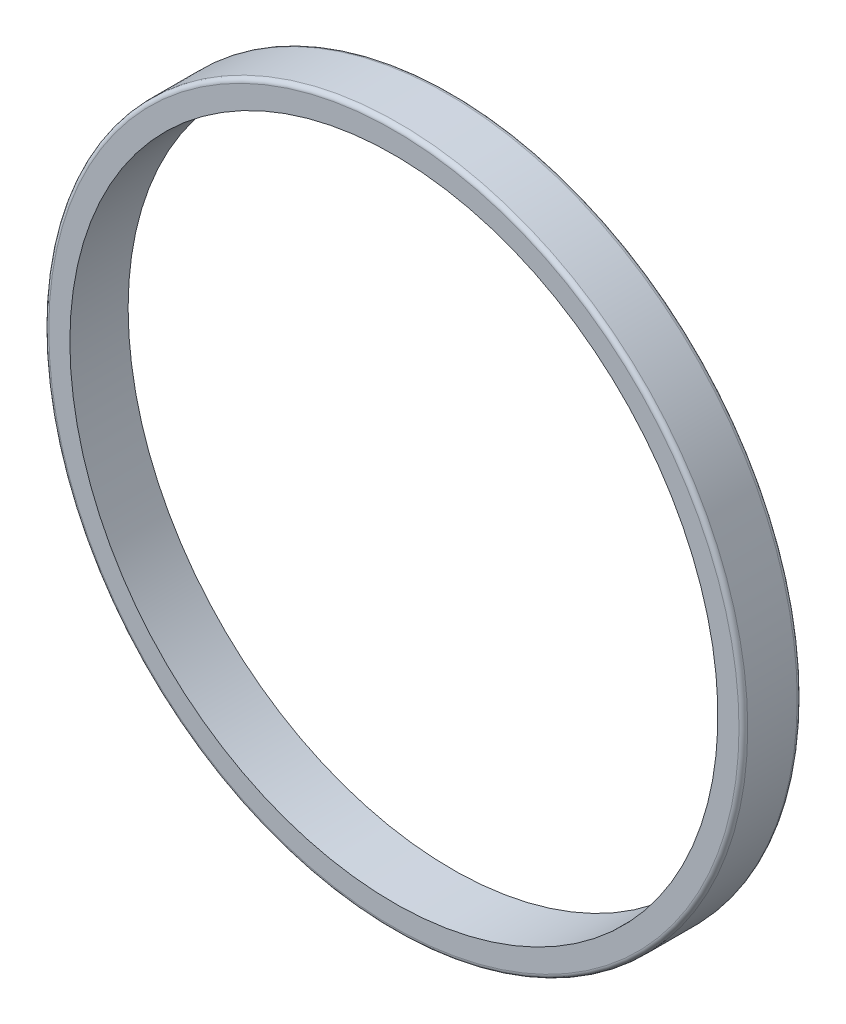
ISO-10303-21;
HEADER;
FILE_DESCRIPTION(('STEP AP214'),'2;1');
FILE_NAME('part.step','',(''),(''),'','','');
FILE_SCHEMA(('AUTOMOTIVE_DESIGN { 1 0 10303 214 1 1 1 1 }'));
ENDSEC;
DATA;
#1=APPLICATION_CONTEXT('core data for automotive mechanical design processes');
#2=APPLICATION_PROTOCOL_DEFINITION('international standard','automotive_design',2000,#1);
#3=PRODUCT_CONTEXT('',#1,'mechanical');
#4=PRODUCT('Part','Part','',(#3));
#5=PRODUCT_RELATED_PRODUCT_CATEGORY('part','',(#4));
#6=PRODUCT_DEFINITION_FORMATION('','',#4);
#7=PRODUCT_DEFINITION_CONTEXT('part definition',#1,'design');
#8=PRODUCT_DEFINITION('design','',#6,#7);
#9=PRODUCT_DEFINITION_SHAPE('','',#8);
#10=(LENGTH_UNIT() NAMED_UNIT(*) SI_UNIT(.MILLI.,.METRE.));
#11=(NAMED_UNIT(*) PLANE_ANGLE_UNIT() SI_UNIT($,.RADIAN.));
#12=(NAMED_UNIT(*) SI_UNIT($,.STERADIAN.) SOLID_ANGLE_UNIT());
#13=UNCERTAINTY_MEASURE_WITH_UNIT(LENGTH_MEASURE(1.E-05),#10,'distance_accuracy_value','');
#14=(GEOMETRIC_REPRESENTATION_CONTEXT(3) GLOBAL_UNCERTAINTY_ASSIGNED_CONTEXT((#13)) GLOBAL_UNIT_ASSIGNED_CONTEXT((#10,
#11,#12)) REPRESENTATION_CONTEXT('',''));
#15=CARTESIAN_POINT('',(0.,0.,0.));
#16=DIRECTION('',(0.,0.,1.));
#17=DIRECTION('',(1.,0.,0.));
#18=AXIS2_PLACEMENT_3D('',#15,#16,#17);
#19=CARTESIAN_POINT('',(0.,0.,63.1));
#20=DIRECTION('',(0.,0.,-1.));
#21=DIRECTION('',(-1.,0.,0.));
#22=AXIS2_PLACEMENT_3D('',#19,#20,#21);
#23=TOROIDAL_SURFACE('',#22,47.4,0.6);
#24=CARTESIAN_POINT('',(0.,0.,62.5));
#25=DIRECTION('',(0.,0.,1.));
#26=DIRECTION('',(1.,0.,0.));
#27=AXIS2_PLACEMENT_3D('',#24,#25,#26);
#28=CIRCLE('',#27,47.4);
#29=CARTESIAN_POINT('',(-47.4,0.,62.5));
#30=VERTEX_POINT('',#29);
#31=CARTESIAN_POINT('',(47.4,0.,62.5));
#32=VERTEX_POINT('',#31);
#33=EDGE_CURVE('E11',#30,#32,#28,.T.);
#34=ORIENTED_EDGE('',*,*,#33,.T.);
#35=CARTESIAN_POINT('',(47.4,0.,63.1));
#36=DIRECTION('',(0.,-1.,0.));
#37=DIRECTION('',(1.,0.,0.));
#38=AXIS2_PLACEMENT_3D('',#35,#36,#37);
#39=CIRCLE('',#38,0.6);
#40=CARTESIAN_POINT('',(48.,0.,63.1));
#41=VERTEX_POINT('',#40);
#42=EDGE_CURVE('E26',#32,#41,#39,.T.);
#43=ORIENTED_EDGE('',*,*,#42,.T.);
#44=CARTESIAN_POINT('',(0.,0.,63.1));
#45=DIRECTION('',(0.,0.,-1.));
#46=DIRECTION('',(1.,0.,0.));
#47=AXIS2_PLACEMENT_3D('',#44,#45,#46);
#48=CIRCLE('',#47,48.);
#49=CARTESIAN_POINT('',(-48.,0.,63.1));
#50=VERTEX_POINT('',#49);
#51=EDGE_CURVE('E110',#41,#50,#48,.T.);
#52=ORIENTED_EDGE('',*,*,#51,.T.);
#53=CARTESIAN_POINT('',(0.,0.,63.1));
#54=DIRECTION('',(0.,0.,-1.));
#55=DIRECTION('',(1.,0.,0.));
#56=AXIS2_PLACEMENT_3D('',#53,#54,#55);
#57=CIRCLE('',#56,48.);
#58=EDGE_CURVE('E87',#50,#41,#57,.T.);
#59=ORIENTED_EDGE('',*,*,#58,.T.);
#60=ORIENTED_EDGE('',*,*,#42,.F.);
#61=CARTESIAN_POINT('',(0.,0.,62.5));
#62=DIRECTION('',(0.,0.,1.));
#63=DIRECTION('',(1.,0.,0.));
#64=AXIS2_PLACEMENT_3D('',#61,#62,#63);
#65=CIRCLE('',#64,47.4);
#66=EDGE_CURVE('E96',#32,#30,#65,.T.);
#67=ORIENTED_EDGE('',*,*,#66,.T.);
#68=EDGE_LOOP('',(#34,#43,#52,#59,#60,#67));
#69=FACE_BOUND('',#68,.T.);
#70=ADVANCED_FACE('F16',(#69),#23,.T.);
#71=CARTESIAN_POINT('',(0.,0.,66.5));
#72=DIRECTION('',(0.,0.,1.));
#73=DIRECTION('',(1.,0.,0.));
#74=AXIS2_PLACEMENT_3D('',#71,#72,#73);
#75=CYLINDRICAL_SURFACE('',#74,48.);
#76=CARTESIAN_POINT('',(0.,0.,69.9));
#77=DIRECTION('',(0.,0.,1.));
#78=DIRECTION('',(1.,0.,0.));
#79=AXIS2_PLACEMENT_3D('',#76,#77,#78);
#80=CIRCLE('',#79,48.);
#81=CARTESIAN_POINT('',(-48.,0.,69.9));
#82=VERTEX_POINT('',#81);
#83=EDGE_CURVE('E75',#82,#82,#80,.T.);
#84=ORIENTED_EDGE('',*,*,#83,.F.);
#85=DIRECTION('',(0.,0.,-1.));
#86=VECTOR('',#85,1.);
#87=CARTESIAN_POINT('',(-48.,0.,66.5));
#88=LINE('',#87,#86);
#89=EDGE_CURVE('E91',#82,#50,#88,.T.);
#90=ORIENTED_EDGE('',*,*,#89,.T.);
#91=ORIENTED_EDGE('',*,*,#51,.F.);
#92=ORIENTED_EDGE('',*,*,#58,.F.);
#93=ORIENTED_EDGE('',*,*,#89,.F.);
#94=EDGE_LOOP('',(#84,#90,#91,#92,#93));
#95=FACE_BOUND('',#94,.T.);
#96=ADVANCED_FACE('F121',(#95),#75,.T.);
#97=CARTESIAN_POINT('',(0.,0.,62.5));
#98=DIRECTION('',(0.,0.,1.));
#99=DIRECTION('',(1.,0.,0.));
#100=AXIS2_PLACEMENT_3D('',#97,#98,#99);
#101=PLANE('',#100);
#102=ORIENTED_EDGE('',*,*,#33,.F.);
#103=ORIENTED_EDGE('',*,*,#66,.F.);
#104=EDGE_LOOP('',(#102,#103));
#105=FACE_BOUND('',#104,.T.);
#106=CARTESIAN_POINT('',(0.,0.,62.5));
#107=DIRECTION('',(0.,0.,1.));
#108=DIRECTION('',(1.,0.,0.));
#109=AXIS2_PLACEMENT_3D('',#106,#107,#108);
#110=CIRCLE('',#109,44.5);
#111=CARTESIAN_POINT('',(-44.5,0.,62.5));
#112=VERTEX_POINT('',#111);
#113=EDGE_CURVE('E89',#112,#112,#110,.T.);
#114=ORIENTED_EDGE('',*,*,#113,.T.);
#115=EDGE_LOOP('',(#114));
#116=FACE_BOUND('',#115,.T.);
#117=ADVANCED_FACE('F18',(#105,#116),#101,.F.);
#118=CARTESIAN_POINT('',(0.,0.,69.9));
#119=DIRECTION('',(0.,0.,1.));
#120=DIRECTION('',(1.,0.,0.));
#121=AXIS2_PLACEMENT_3D('',#118,#119,#120);
#122=TOROIDAL_SURFACE('',#121,47.4,0.6);
#123=CARTESIAN_POINT('',(0.,0.,70.5));
#124=DIRECTION('',(0.,0.,-1.));
#125=DIRECTION('',(1.,0.,0.));
#126=AXIS2_PLACEMENT_3D('',#123,#124,#125);
#127=CIRCLE('',#126,47.4);
#128=CARTESIAN_POINT('',(-47.4,0.,70.5));
#129=VERTEX_POINT('',#128);
#130=EDGE_CURVE('E59',#129,#129,#127,.T.);
#131=ORIENTED_EDGE('',*,*,#130,.T.);
#132=CARTESIAN_POINT('',(-47.4,0.,69.9));
#133=DIRECTION('',(0.,-1.,0.));
#134=DIRECTION('',(-1.,0.,0.));
#135=AXIS2_PLACEMENT_3D('',#132,#133,#134);
#136=CIRCLE('',#135,0.6);
#137=EDGE_CURVE('E82',#129,#82,#136,.T.);
#138=ORIENTED_EDGE('',*,*,#137,.T.);
#139=ORIENTED_EDGE('',*,*,#83,.T.);
#140=ORIENTED_EDGE('',*,*,#137,.F.);
#141=EDGE_LOOP('',(#131,#138,#139,#140));
#142=FACE_BOUND('',#141,.T.);
#143=ADVANCED_FACE('F120',(#142),#122,.T.);
#144=CARTESIAN_POINT('',(0.,0.,70.5));
#145=DIRECTION('',(0.,0.,1.));
#146=DIRECTION('',(1.,0.,0.));
#147=AXIS2_PLACEMENT_3D('',#144,#145,#146);
#148=PLANE('',#147);
#149=ORIENTED_EDGE('',*,*,#130,.F.);
#150=EDGE_LOOP('',(#149));
#151=FACE_BOUND('',#150,.T.);
#152=CARTESIAN_POINT('',(0.,0.,70.5));
#153=DIRECTION('',(0.,0.,-1.));
#154=DIRECTION('',(1.,0.,0.));
#155=AXIS2_PLACEMENT_3D('',#152,#153,#154);
#156=CIRCLE('',#155,44.5);
#157=CARTESIAN_POINT('',(-44.5,0.,70.5));
#158=VERTEX_POINT('',#157);
#159=EDGE_CURVE('E70',#158,#158,#156,.T.);
#160=ORIENTED_EDGE('',*,*,#159,.T.);
#161=EDGE_LOOP('',(#160));
#162=FACE_BOUND('',#161,.T.);
#163=ADVANCED_FACE('F127',(#151,#162),#148,.T.);
#164=CARTESIAN_POINT('',(0.,0.,66.5));
#165=DIRECTION('',(0.,0.,1.));
#166=DIRECTION('',(1.,0.,0.));
#167=AXIS2_PLACEMENT_3D('',#164,#165,#166);
#168=CYLINDRICAL_SURFACE('',#167,44.5);
#169=ORIENTED_EDGE('',*,*,#159,.F.);
#170=DIRECTION('',(0.,0.,-1.));
#171=VECTOR('',#170,1.);
#172=CARTESIAN_POINT('',(-44.5,0.,66.5));
#173=LINE('',#172,#171);
#174=EDGE_CURVE('E72',#158,#112,#173,.T.);
#175=ORIENTED_EDGE('',*,*,#174,.T.);
#176=ORIENTED_EDGE('',*,*,#113,.F.);
#177=ORIENTED_EDGE('',*,*,#174,.F.);
#178=EDGE_LOOP('',(#169,#175,#176,#177));
#179=FACE_BOUND('',#178,.T.);
#180=ADVANCED_FACE('F71',(#179),#168,.F.);
#181=CLOSED_SHELL('',(#70,#96,#117,#143,#163,#180));
#182=MANIFOLD_SOLID_BREP('B1',#181);
#183=ADVANCED_BREP_SHAPE_REPRESENTATION('',(#18,#182),#14);
#184=SHAPE_DEFINITION_REPRESENTATION(#9,#183);
ENDSEC;
END-ISO-10303-21;
